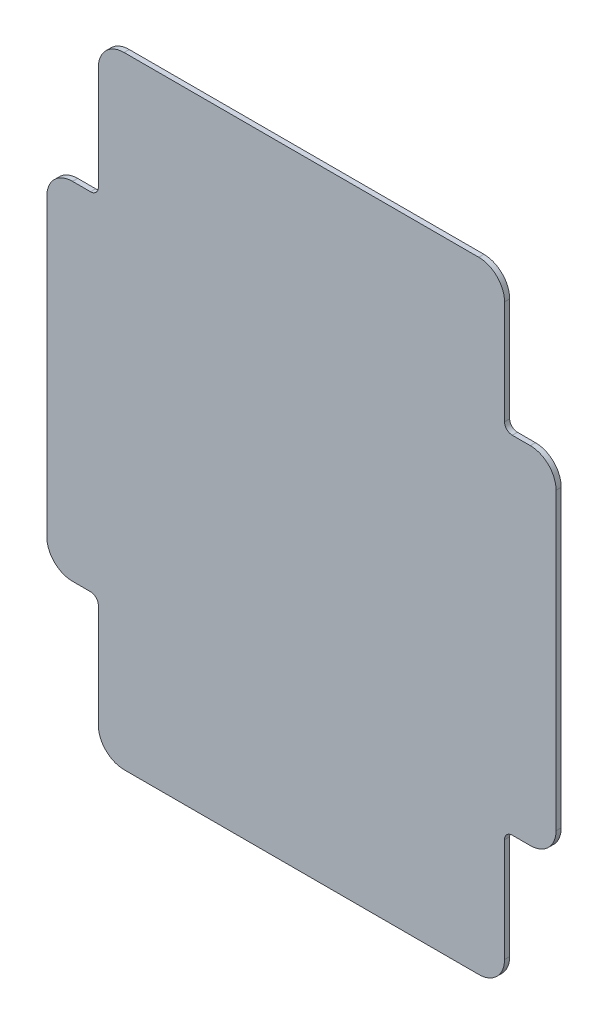
ISO-10303-21;
HEADER;
FILE_DESCRIPTION(('STEP AP214'),'2;1');
FILE_NAME('part.step','',(''),(''),'','','');
FILE_SCHEMA(('AUTOMOTIVE_DESIGN { 1 0 10303 214 1 1 1 1 }'));
ENDSEC;
DATA;
#1=APPLICATION_CONTEXT('core data for automotive mechanical design processes');
#2=APPLICATION_PROTOCOL_DEFINITION('international standard','automotive_design',2000,#1);
#3=PRODUCT_CONTEXT('',#1,'mechanical');
#4=PRODUCT('Part','Part','',(#3));
#5=PRODUCT_RELATED_PRODUCT_CATEGORY('part','',(#4));
#6=PRODUCT_DEFINITION_FORMATION('','',#4);
#7=PRODUCT_DEFINITION_CONTEXT('part definition',#1,'design');
#8=PRODUCT_DEFINITION('design','',#6,#7);
#9=PRODUCT_DEFINITION_SHAPE('','',#8);
#10=(LENGTH_UNIT() NAMED_UNIT(*) SI_UNIT(.MILLI.,.METRE.));
#11=(NAMED_UNIT(*) PLANE_ANGLE_UNIT() SI_UNIT($,.RADIAN.));
#12=(NAMED_UNIT(*) SI_UNIT($,.STERADIAN.) SOLID_ANGLE_UNIT());
#13=UNCERTAINTY_MEASURE_WITH_UNIT(LENGTH_MEASURE(1.E-05),#10,'distance_accuracy_value','');
#14=(GEOMETRIC_REPRESENTATION_CONTEXT(3) GLOBAL_UNCERTAINTY_ASSIGNED_CONTEXT((#13)) GLOBAL_UNIT_ASSIGNED_CONTEXT((#10,
#11,#12)) REPRESENTATION_CONTEXT('',''));
#15=CARTESIAN_POINT('',(0.,0.,0.));
#16=DIRECTION('',(0.,0.,1.));
#17=DIRECTION('',(1.,0.,0.));
#18=AXIS2_PLACEMENT_3D('',#15,#16,#17);
#19=CARTESIAN_POINT('',(-79.2022354263775,53.,2.));
#20=DIRECTION('',(1.,0.,0.));
#21=DIRECTION('',(0.,1.,0.));
#22=AXIS2_PLACEMENT_3D('',#19,#20,#21);
#23=PLANE('',#22);
#24=DIRECTION('',(0.,-1.,0.));
#25=VECTOR('',#24,1.);
#26=CARTESIAN_POINT('',(-79.2022354263775,53.,0.));
#27=LINE('',#26,#25);
#28=CARTESIAN_POINT('',(-79.2022354263775,48.,0.));
#29=VERTEX_POINT('',#28);
#30=CARTESIAN_POINT('',(-79.2022354263775,7.69999999999999,0.));
#31=VERTEX_POINT('',#30);
#32=EDGE_CURVE('E212',#29,#31,#27,.T.);
#33=ORIENTED_EDGE('',*,*,#32,.T.);
#34=DIRECTION('',(0.,0.,-1.));
#35=VECTOR('',#34,1.);
#36=CARTESIAN_POINT('',(-79.2022354263775,7.69999999999996,2.));
#37=LINE('',#36,#35);
#38=CARTESIAN_POINT('',(-79.2022354263775,7.69999999999999,2.));
#39=VERTEX_POINT('',#38);
#40=EDGE_CURVE('E60',#31,#39,#37,.F.);
#41=ORIENTED_EDGE('',*,*,#40,.T.);
#42=DIRECTION('',(0.,-1.,0.));
#43=VECTOR('',#42,1.);
#44=CARTESIAN_POINT('',(-79.2022354263775,58.,2.));
#45=LINE('',#44,#43);
#46=CARTESIAN_POINT('',(-79.2022354263775,48.,2.));
#47=VERTEX_POINT('',#46);
#48=EDGE_CURVE('E213',#47,#39,#45,.T.);
#49=ORIENTED_EDGE('',*,*,#48,.F.);
#50=DIRECTION('',(0.,0.,-1.));
#51=VECTOR('',#50,1.);
#52=CARTESIAN_POINT('',(-79.2022354263775,48.,2.));
#53=LINE('',#52,#51);
#54=EDGE_CURVE('E204',#47,#29,#53,.T.);
#55=ORIENTED_EDGE('',*,*,#54,.T.);
#56=EDGE_LOOP('',(#33,#41,#49,#55));
#57=FACE_BOUND('',#56,.T.);
#58=ADVANCED_FACE('F38',(#57),#23,.F.);
#59=CARTESIAN_POINT('',(-79.2022354263775,4.69999999999998,2.));
#60=DIRECTION('',(0.,-1.,0.));
#61=DIRECTION('',(1.,0.,0.));
#62=AXIS2_PLACEMENT_3D('',#59,#60,#61);
#63=PLANE('',#62);
#64=DIRECTION('',(-1.,0.,0.));
#65=VECTOR('',#64,1.);
#66=CARTESIAN_POINT('',(-79.2022354263775,4.69999999999998,2.));
#67=LINE('',#66,#65);
#68=CARTESIAN_POINT('',(-82.2022354263775,4.69999999999998,2.));
#69=VERTEX_POINT('',#68);
#70=CARTESIAN_POINT('',(-89.2022354263775,4.69999999999995,2.));
#71=VERTEX_POINT('',#70);
#72=EDGE_CURVE('E502',#69,#71,#67,.T.);
#73=ORIENTED_EDGE('',*,*,#72,.F.);
#74=DIRECTION('',(0.,0.,-1.));
#75=VECTOR('',#74,1.);
#76=CARTESIAN_POINT('',(-82.2022354263775,4.69999999999998,0.));
#77=LINE('',#76,#75);
#78=CARTESIAN_POINT('',(-82.2022354263775,4.69999999999998,0.));
#79=VERTEX_POINT('',#78);
#80=EDGE_CURVE('E386',#69,#79,#77,.T.);
#81=ORIENTED_EDGE('',*,*,#80,.T.);
#82=DIRECTION('',(-1.,0.,0.));
#83=VECTOR('',#82,1.);
#84=CARTESIAN_POINT('',(-79.2022354263775,4.69999999999998,0.));
#85=LINE('',#84,#83);
#86=CARTESIAN_POINT('',(-89.2022354263775,4.69999999999995,0.));
#87=VERTEX_POINT('',#86);
#88=EDGE_CURVE('E220',#79,#87,#85,.T.);
#89=ORIENTED_EDGE('',*,*,#88,.T.);
#90=DIRECTION('',(0.,0.,-1.));
#91=VECTOR('',#90,1.);
#92=CARTESIAN_POINT('',(-89.2022354263775,4.69999999999995,2.));
#93=LINE('',#92,#91);
#94=EDGE_CURVE('E323',#87,#71,#93,.F.);
#95=ORIENTED_EDGE('',*,*,#94,.T.);
#96=EDGE_LOOP('',(#73,#81,#89,#95));
#97=FACE_BOUND('',#96,.T.);
#98=ADVANCED_FACE('F527',(#97),#63,.F.);
#99=CARTESIAN_POINT('',(-99.2022354263775,4.69999999999995,2.));
#100=DIRECTION('',(1.,0.,0.));
#101=DIRECTION('',(0.,1.,0.));
#102=AXIS2_PLACEMENT_3D('',#99,#100,#101);
#103=PLANE('',#102);
#104=DIRECTION('',(0.,-1.,0.));
#105=VECTOR('',#104,1.);
#106=CARTESIAN_POINT('',(-99.2022354263775,4.69999999999995,2.));
#107=LINE('',#106,#105);
#108=CARTESIAN_POINT('',(-99.2022354263775,-5.30000000000004,2.));
#109=VERTEX_POINT('',#108);
#110=CARTESIAN_POINT('',(-99.2022354263775,-119.7,2.));
#111=VERTEX_POINT('',#110);
#112=EDGE_CURVE('E497',#109,#111,#107,.T.);
#113=ORIENTED_EDGE('',*,*,#112,.F.);
#114=DIRECTION('',(0.,0.,-1.));
#115=VECTOR('',#114,1.);
#116=CARTESIAN_POINT('',(-99.2022354263775,-5.30000000000004,2.));
#117=LINE('',#116,#115);
#118=CARTESIAN_POINT('',(-99.2022354263775,-5.30000000000004,0.));
#119=VERTEX_POINT('',#118);
#120=EDGE_CURVE('E319',#109,#119,#117,.T.);
#121=ORIENTED_EDGE('',*,*,#120,.T.);
#122=DIRECTION('',(0.,-1.,0.));
#123=VECTOR('',#122,1.);
#124=CARTESIAN_POINT('',(-99.2022354263775,4.69999999999995,0.));
#125=LINE('',#124,#123);
#126=CARTESIAN_POINT('',(-99.2022354263775,-119.7,0.));
#127=VERTEX_POINT('',#126);
#128=EDGE_CURVE('E224',#119,#127,#125,.T.);
#129=ORIENTED_EDGE('',*,*,#128,.T.);
#130=DIRECTION('',(0.,0.,-1.));
#131=VECTOR('',#130,1.);
#132=CARTESIAN_POINT('',(-99.2022354263775,-119.7,2.));
#133=LINE('',#132,#131);
#134=EDGE_CURVE('E316',#127,#111,#133,.F.);
#135=ORIENTED_EDGE('',*,*,#134,.T.);
#136=EDGE_LOOP('',(#113,#121,#129,#135));
#137=FACE_BOUND('',#136,.T.);
#138=ADVANCED_FACE('F537',(#137),#103,.F.);
#139=CARTESIAN_POINT('',(-99.2022354263775,-129.7,2.));
#140=DIRECTION('',(0.,1.,0.));
#141=DIRECTION('',(0.,0.,1.));
#142=AXIS2_PLACEMENT_3D('',#139,#140,#141);
#143=PLANE('',#142);
#144=DIRECTION('',(1.,0.,0.));
#145=VECTOR('',#144,1.);
#146=CARTESIAN_POINT('',(-99.2022354263775,-129.7,0.));
#147=LINE('',#146,#145);
#148=CARTESIAN_POINT('',(-89.2022354263775,-129.7,0.));
#149=VERTEX_POINT('',#148);
#150=CARTESIAN_POINT('',(-82.2022354263769,-129.7,0.));
#151=VERTEX_POINT('',#150);
#152=EDGE_CURVE('E232',#149,#151,#147,.T.);
#153=ORIENTED_EDGE('',*,*,#152,.T.);
#154=DIRECTION('',(0.,0.,-1.));
#155=VECTOR('',#154,1.);
#156=CARTESIAN_POINT('',(-82.2022354263769,-129.7,2.));
#157=LINE('',#156,#155);
#158=CARTESIAN_POINT('',(-82.2022354263769,-129.7,2.));
#159=VERTEX_POINT('',#158);
#160=EDGE_CURVE('E369',#151,#159,#157,.F.);
#161=ORIENTED_EDGE('',*,*,#160,.T.);
#162=DIRECTION('',(1.,0.,0.));
#163=VECTOR('',#162,1.);
#164=CARTESIAN_POINT('',(-99.2022354263775,-129.7,2.));
#165=LINE('',#164,#163);
#166=CARTESIAN_POINT('',(-89.2022354263775,-129.7,2.));
#167=VERTEX_POINT('',#166);
#168=EDGE_CURVE('E492',#167,#159,#165,.T.);
#169=ORIENTED_EDGE('',*,*,#168,.F.);
#170=DIRECTION('',(0.,0.,-1.));
#171=VECTOR('',#170,1.);
#172=CARTESIAN_POINT('',(-89.2022354263775,-129.7,2.));
#173=LINE('',#172,#171);
#174=EDGE_CURVE('E327',#167,#149,#173,.T.);
#175=ORIENTED_EDGE('',*,*,#174,.T.);
#176=EDGE_LOOP('',(#153,#161,#169,#175));
#177=FACE_BOUND('',#176,.T.);
#178=ADVANCED_FACE('F545',(#177),#143,.F.);
#179=CARTESIAN_POINT('',(-79.2022354263774,-178.,2.));
#180=DIRECTION('',(1.,0.,0.));
#181=DIRECTION('',(0.,1.,0.));
#182=AXIS2_PLACEMENT_3D('',#179,#180,#181);
#183=PLANE('',#182);
#184=DIRECTION('',(0.,-1.,0.));
#185=VECTOR('',#184,1.);
#186=CARTESIAN_POINT('',(-79.2022354263774,-129.7,2.));
#187=LINE('',#186,#185);
#188=CARTESIAN_POINT('',(-79.2022354263774,-132.7,2.));
#189=VERTEX_POINT('',#188);
#190=CARTESIAN_POINT('',(-79.2022354263774,-173.,2.));
#191=VERTEX_POINT('',#190);
#192=EDGE_CURVE('E488',#189,#191,#187,.T.);
#193=ORIENTED_EDGE('',*,*,#192,.F.);
#194=DIRECTION('',(0.,0.,-1.));
#195=VECTOR('',#194,1.);
#196=CARTESIAN_POINT('',(-79.2022354263769,-132.7,0.));
#197=LINE('',#196,#195);
#198=CARTESIAN_POINT('',(-79.2022354263769,-132.7,0.));
#199=VERTEX_POINT('',#198);
#200=EDGE_CURVE('E365',#189,#199,#197,.T.);
#201=ORIENTED_EDGE('',*,*,#200,.T.);
#202=DIRECTION('',(0.,-1.,0.));
#203=VECTOR('',#202,1.);
#204=CARTESIAN_POINT('',(-79.2022354263774,-178.,0.));
#205=LINE('',#204,#203);
#206=CARTESIAN_POINT('',(-79.2022354263774,-173.,0.));
#207=VERTEX_POINT('',#206);
#208=EDGE_CURVE('E236',#199,#207,#205,.T.);
#209=ORIENTED_EDGE('',*,*,#208,.T.);
#210=DIRECTION('',(0.,0.,-1.));
#211=VECTOR('',#210,1.);
#212=CARTESIAN_POINT('',(-79.2022354263774,-173.,2.));
#213=LINE('',#212,#211);
#214=EDGE_CURVE('E338',#207,#191,#213,.F.);
#215=ORIENTED_EDGE('',*,*,#214,.T.);
#216=EDGE_LOOP('',(#193,#201,#209,#215));
#217=FACE_BOUND('',#216,.T.);
#218=ADVANCED_FACE('F553',(#217),#183,.F.);
#219=CARTESIAN_POINT('',(-79.2022354263775,-183.,2.));
#220=DIRECTION('',(0.,1.,0.));
#221=DIRECTION('',(0.,0.,1.));
#222=AXIS2_PLACEMENT_3D('',#219,#220,#221);
#223=PLANE('',#222);
#224=DIRECTION('',(1.,0.,0.));
#225=VECTOR('',#224,1.);
#226=CARTESIAN_POINT('',(-79.2022354263775,-183.,2.));
#227=LINE('',#226,#225);
#228=CARTESIAN_POINT('',(-69.2022354263774,-183.,2.));
#229=VERTEX_POINT('',#228);
#230=CARTESIAN_POINT('',(68.3977645736226,-183.,2.));
#231=VERTEX_POINT('',#230);
#232=EDGE_CURVE('E483',#229,#231,#227,.T.);
#233=ORIENTED_EDGE('',*,*,#232,.F.);
#234=DIRECTION('',(0.,0.,-1.));
#235=VECTOR('',#234,1.);
#236=CARTESIAN_POINT('',(-69.2022354263774,-183.,2.));
#237=LINE('',#236,#235);
#238=CARTESIAN_POINT('',(-69.2022354263774,-183.,0.));
#239=VERTEX_POINT('',#238);
#240=EDGE_CURVE('E334',#229,#239,#237,.T.);
#241=ORIENTED_EDGE('',*,*,#240,.T.);
#242=DIRECTION('',(1.,0.,0.));
#243=VECTOR('',#242,1.);
#244=CARTESIAN_POINT('',(-79.2022354263775,-183.,0.));
#245=LINE('',#244,#243);
#246=CARTESIAN_POINT('',(68.3977645736226,-183.,0.));
#247=VERTEX_POINT('',#246);
#248=EDGE_CURVE('E239',#239,#247,#245,.T.);
#249=ORIENTED_EDGE('',*,*,#248,.T.);
#250=DIRECTION('',(0.,0.,-1.));
#251=VECTOR('',#250,1.);
#252=CARTESIAN_POINT('',(68.3977645736226,-183.,2.));
#253=LINE('',#252,#251);
#254=EDGE_CURVE('E331',#247,#231,#253,.F.);
#255=ORIENTED_EDGE('',*,*,#254,.T.);
#256=EDGE_LOOP('',(#233,#241,#249,#255));
#257=FACE_BOUND('',#256,.T.);
#258=ADVANCED_FACE('F563',(#257),#223,.F.);
#259=CARTESIAN_POINT('',(78.3977645736226,-178.,2.));
#260=DIRECTION('',(-1.,0.,0.));
#261=DIRECTION('',(0.,-1.,0.));
#262=AXIS2_PLACEMENT_3D('',#259,#260,#261);
#263=PLANE('',#262);
#264=DIRECTION('',(0.,1.,0.));
#265=VECTOR('',#264,1.);
#266=CARTESIAN_POINT('',(78.3977645736226,-178.,0.));
#267=LINE('',#266,#265);
#268=CARTESIAN_POINT('',(78.3977645736226,-173.,0.));
#269=VERTEX_POINT('',#268);
#270=CARTESIAN_POINT('',(78.3977645736226,-132.7,0.));
#271=VERTEX_POINT('',#270);
#272=EDGE_CURVE('E243',#269,#271,#267,.T.);
#273=ORIENTED_EDGE('',*,*,#272,.T.);
#274=DIRECTION('',(0.,0.,-1.));
#275=VECTOR('',#274,1.);
#276=CARTESIAN_POINT('',(78.3977645736226,-132.7,2.));
#277=LINE('',#276,#275);
#278=CARTESIAN_POINT('',(78.3977645736225,-132.7,2.));
#279=VERTEX_POINT('',#278);
#280=EDGE_CURVE('E376',#271,#279,#277,.F.);
#281=ORIENTED_EDGE('',*,*,#280,.T.);
#282=DIRECTION('',(0.,1.,0.));
#283=VECTOR('',#282,1.);
#284=CARTESIAN_POINT('',(78.3977645736226,-183.,2.));
#285=LINE('',#284,#283);
#286=CARTESIAN_POINT('',(78.3977645736226,-173.,2.));
#287=VERTEX_POINT('',#286);
#288=EDGE_CURVE('E478',#287,#279,#285,.T.);
#289=ORIENTED_EDGE('',*,*,#288,.F.);
#290=DIRECTION('',(0.,0.,-1.));
#291=VECTOR('',#290,1.);
#292=CARTESIAN_POINT('',(78.3977645736226,-173.,2.));
#293=LINE('',#292,#291);
#294=EDGE_CURVE('E342',#287,#269,#293,.T.);
#295=ORIENTED_EDGE('',*,*,#294,.T.);
#296=EDGE_LOOP('',(#273,#281,#289,#295));
#297=FACE_BOUND('',#296,.T.);
#298=ADVANCED_FACE('F572',(#297),#263,.F.);
#299=CARTESIAN_POINT('',(78.3977645736226,-129.7,2.));
#300=DIRECTION('',(0.,1.,0.));
#301=DIRECTION('',(-1.,0.,0.));
#302=AXIS2_PLACEMENT_3D('',#299,#300,#301);
#303=PLANE('',#302);
#304=DIRECTION('',(1.,0.,0.));
#305=VECTOR('',#304,1.);
#306=CARTESIAN_POINT('',(78.3977645736226,-129.7,2.));
#307=LINE('',#306,#305);
#308=CARTESIAN_POINT('',(81.3977645736226,-129.7,2.));
#309=VERTEX_POINT('',#308);
#310=CARTESIAN_POINT('',(88.3977645736225,-129.7,2.));
#311=VERTEX_POINT('',#310);
#312=EDGE_CURVE('E474',#309,#311,#307,.T.);
#313=ORIENTED_EDGE('',*,*,#312,.F.);
#314=DIRECTION('',(0.,0.,-1.));
#315=VECTOR('',#314,1.);
#316=CARTESIAN_POINT('',(81.3977645736226,-129.7,0.));
#317=LINE('',#316,#315);
#318=CARTESIAN_POINT('',(81.3977645736226,-129.7,0.));
#319=VERTEX_POINT('',#318);
#320=EDGE_CURVE('E372',#309,#319,#317,.T.);
#321=ORIENTED_EDGE('',*,*,#320,.T.);
#322=DIRECTION('',(1.,0.,0.));
#323=VECTOR('',#322,1.);
#324=CARTESIAN_POINT('',(78.3977645736226,-129.7,0.));
#325=LINE('',#324,#323);
#326=CARTESIAN_POINT('',(88.3977645736225,-129.7,0.));
#327=VERTEX_POINT('',#326);
#328=EDGE_CURVE('E247',#319,#327,#325,.T.);
#329=ORIENTED_EDGE('',*,*,#328,.T.);
#330=DIRECTION('',(0.,0.,-1.));
#331=VECTOR('',#330,1.);
#332=CARTESIAN_POINT('',(88.3977645736225,-129.7,2.));
#333=LINE('',#332,#331);
#334=EDGE_CURVE('E353',#327,#311,#333,.F.);
#335=ORIENTED_EDGE('',*,*,#334,.T.);
#336=EDGE_LOOP('',(#313,#321,#329,#335));
#337=FACE_BOUND('',#336,.T.);
#338=ADVANCED_FACE('F580',(#337),#303,.F.);
#339=CARTESIAN_POINT('',(98.3977645736225,-129.7,2.));
#340=DIRECTION('',(-1.,0.,0.));
#341=DIRECTION('',(0.,0.,1.));
#342=AXIS2_PLACEMENT_3D('',#339,#340,#341);
#343=PLANE('',#342);
#344=DIRECTION('',(0.,1.,0.));
#345=VECTOR('',#344,1.);
#346=CARTESIAN_POINT('',(98.3977645736225,-129.7,2.));
#347=LINE('',#346,#345);
#348=CARTESIAN_POINT('',(98.3977645736225,-119.7,2.));
#349=VERTEX_POINT('',#348);
#350=CARTESIAN_POINT('',(98.3977645736225,-5.29999999999999,2.));
#351=VERTEX_POINT('',#350);
#352=EDGE_CURVE('E469',#349,#351,#347,.T.);
#353=ORIENTED_EDGE('',*,*,#352,.F.);
#354=DIRECTION('',(0.,0.,-1.));
#355=VECTOR('',#354,1.);
#356=CARTESIAN_POINT('',(98.3977645736225,-119.7,2.));
#357=LINE('',#356,#355);
#358=CARTESIAN_POINT('',(98.3977645736225,-119.7,0.));
#359=VERTEX_POINT('',#358);
#360=EDGE_CURVE('E349',#349,#359,#357,.T.);
#361=ORIENTED_EDGE('',*,*,#360,.T.);
#362=DIRECTION('',(0.,1.,0.));
#363=VECTOR('',#362,1.);
#364=CARTESIAN_POINT('',(98.3977645736225,-129.7,0.));
#365=LINE('',#364,#363);
#366=CARTESIAN_POINT('',(98.3977645736225,-5.29999999999999,0.));
#367=VERTEX_POINT('',#366);
#368=EDGE_CURVE('E250',#359,#367,#365,.T.);
#369=ORIENTED_EDGE('',*,*,#368,.T.);
#370=DIRECTION('',(0.,0.,-1.));
#371=VECTOR('',#370,1.);
#372=CARTESIAN_POINT('',(98.3977645736225,-5.29999999999999,2.));
#373=LINE('',#372,#371);
#374=EDGE_CURVE('E346',#367,#351,#373,.F.);
#375=ORIENTED_EDGE('',*,*,#374,.T.);
#376=EDGE_LOOP('',(#353,#361,#369,#375));
#377=FACE_BOUND('',#376,.T.);
#378=ADVANCED_FACE('F590',(#377),#343,.F.);
#379=CARTESIAN_POINT('',(98.3977645736225,4.69999999999998,2.));
#380=DIRECTION('',(0.,-1.,0.));
#381=DIRECTION('',(1.,0.,0.));
#382=AXIS2_PLACEMENT_3D('',#379,#380,#381);
#383=PLANE('',#382);
#384=DIRECTION('',(-1.,0.,0.));
#385=VECTOR('',#384,1.);
#386=CARTESIAN_POINT('',(98.3977645736225,4.69999999999998,0.));
#387=LINE('',#386,#385);
#388=CARTESIAN_POINT('',(88.3977645736226,4.70000000000001,0.));
#389=VERTEX_POINT('',#388);
#390=CARTESIAN_POINT('',(81.3977645736224,4.70000000000004,0.));
#391=VERTEX_POINT('',#390);
#392=EDGE_CURVE('E254',#389,#391,#387,.T.);
#393=ORIENTED_EDGE('',*,*,#392,.T.);
#394=DIRECTION('',(0.,0.,-1.));
#395=VECTOR('',#394,1.);
#396=CARTESIAN_POINT('',(81.3977645736224,4.70000000000004,2.));
#397=LINE('',#396,#395);
#398=CARTESIAN_POINT('',(81.3977645736224,4.70000000000004,2.));
#399=VERTEX_POINT('',#398);
#400=EDGE_CURVE('E383',#391,#399,#397,.F.);
#401=ORIENTED_EDGE('',*,*,#400,.T.);
#402=DIRECTION('',(-1.,0.,0.));
#403=VECTOR('',#402,1.);
#404=CARTESIAN_POINT('',(98.3977645736225,4.69999999999998,2.));
#405=LINE('',#404,#403);
#406=CARTESIAN_POINT('',(88.3977645736226,4.70000000000001,2.));
#407=VERTEX_POINT('',#406);
#408=EDGE_CURVE('E465',#407,#399,#405,.T.);
#409=ORIENTED_EDGE('',*,*,#408,.F.);
#410=DIRECTION('',(0.,0.,-1.));
#411=VECTOR('',#410,1.);
#412=CARTESIAN_POINT('',(88.3977645736226,4.70000000000001,2.));
#413=LINE('',#412,#411);
#414=EDGE_CURVE('E357',#407,#389,#413,.T.);
#415=ORIENTED_EDGE('',*,*,#414,.T.);
#416=EDGE_LOOP('',(#393,#401,#409,#415));
#417=FACE_BOUND('',#416,.T.);
#418=ADVANCED_FACE('F599',(#417),#383,.F.);
#419=CARTESIAN_POINT('',(78.3977645736225,53.,2.));
#420=DIRECTION('',(-1.,0.,0.));
#421=DIRECTION('',(0.,-1.,0.));
#422=AXIS2_PLACEMENT_3D('',#419,#420,#421);
#423=PLANE('',#422);
#424=DIRECTION('',(0.,1.,0.));
#425=VECTOR('',#424,1.);
#426=CARTESIAN_POINT('',(78.3977645736225,4.70000000000004,2.));
#427=LINE('',#426,#425);
#428=CARTESIAN_POINT('',(78.3977645736225,7.70000000000004,2.));
#429=VERTEX_POINT('',#428);
#430=CARTESIAN_POINT('',(78.3977645736225,48.,2.));
#431=VERTEX_POINT('',#430);
#432=EDGE_CURVE('E462',#429,#431,#427,.T.);
#433=ORIENTED_EDGE('',*,*,#432,.F.);
#434=DIRECTION('',(0.,0.,-1.));
#435=VECTOR('',#434,1.);
#436=CARTESIAN_POINT('',(78.3977645736224,7.70000000000004,0.));
#437=LINE('',#436,#435);
#438=CARTESIAN_POINT('',(78.3977645736224,7.70000000000004,0.));
#439=VERTEX_POINT('',#438);
#440=EDGE_CURVE('E379',#429,#439,#437,.T.);
#441=ORIENTED_EDGE('',*,*,#440,.T.);
#442=DIRECTION('',(0.,1.,0.));
#443=VECTOR('',#442,1.);
#444=CARTESIAN_POINT('',(78.3977645736225,53.,0.));
#445=LINE('',#444,#443);
#446=CARTESIAN_POINT('',(78.3977645736225,48.,0.));
#447=VERTEX_POINT('',#446);
#448=EDGE_CURVE('E258',#439,#447,#445,.T.);
#449=ORIENTED_EDGE('',*,*,#448,.T.);
#450=DIRECTION('',(0.,0.,-1.));
#451=VECTOR('',#450,1.);
#452=CARTESIAN_POINT('',(78.3977645736225,48.,2.));
#453=LINE('',#452,#451);
#454=EDGE_CURVE('E361',#447,#431,#453,.F.);
#455=ORIENTED_EDGE('',*,*,#454,.T.);
#456=EDGE_LOOP('',(#433,#441,#449,#455));
#457=FACE_BOUND('',#456,.T.);
#458=ADVANCED_FACE('F607',(#457),#423,.F.);
#459=CARTESIAN_POINT('',(78.3977645736225,58.,2.));
#460=DIRECTION('',(0.,-1.,0.));
#461=DIRECTION('',(1.,0.,0.));
#462=AXIS2_PLACEMENT_3D('',#459,#460,#461);
#463=PLANE('',#462);
#464=DIRECTION('',(-1.,0.,0.));
#465=VECTOR('',#464,1.);
#466=CARTESIAN_POINT('',(78.3977645736225,58.,0.));
#467=LINE('',#466,#465);
#468=CARTESIAN_POINT('',(68.3977645736225,58.,0.));
#469=VERTEX_POINT('',#468);
#470=CARTESIAN_POINT('',(-69.2022354263775,58.,0.));
#471=VERTEX_POINT('',#470);
#472=EDGE_CURVE('E261',#469,#471,#467,.T.);
#473=ORIENTED_EDGE('',*,*,#472,.T.);
#474=DIRECTION('',(0.,0.,-1.));
#475=VECTOR('',#474,1.);
#476=CARTESIAN_POINT('',(-69.2022354263775,58.,2.));
#477=LINE('',#476,#475);
#478=CARTESIAN_POINT('',(-69.2022354263775,58.,2.));
#479=VERTEX_POINT('',#478);
#480=EDGE_CURVE('E205',#471,#479,#477,.F.);
#481=ORIENTED_EDGE('',*,*,#480,.T.);
#482=DIRECTION('',(-1.,0.,0.));
#483=VECTOR('',#482,1.);
#484=CARTESIAN_POINT('',(78.3977645736225,58.,2.));
#485=LINE('',#484,#483);
#486=CARTESIAN_POINT('',(68.3977645736225,58.,2.));
#487=VERTEX_POINT('',#486);
#488=EDGE_CURVE('E216',#487,#479,#485,.T.);
#489=ORIENTED_EDGE('',*,*,#488,.F.);
#490=DIRECTION('',(0.,0.,-1.));
#491=VECTOR('',#490,1.);
#492=CARTESIAN_POINT('',(68.3977645736225,58.,2.));
#493=LINE('',#492,#491);
#494=EDGE_CURVE('E209',#487,#469,#493,.T.);
#495=ORIENTED_EDGE('',*,*,#494,.T.);
#496=EDGE_LOOP('',(#473,#481,#489,#495));
#497=FACE_BOUND('',#496,.T.);
#498=ADVANCED_FACE('F616',(#497),#463,.F.);
#499=CARTESIAN_POINT('',(0.,0.,2.));
#500=DIRECTION('',(0.,0.,-1.));
#501=DIRECTION('',(-1.,0.,0.));
#502=AXIS2_PLACEMENT_3D('',#499,#500,#501);
#503=PLANE('',#502);
#504=ORIENTED_EDGE('',*,*,#488,.T.);
#505=CARTESIAN_POINT('',(-69.2022354263775,48.,2.));
#506=DIRECTION('',(0.,0.,-1.));
#507=DIRECTION('',(-1.,0.,0.));
#508=AXIS2_PLACEMENT_3D('',#505,#506,#507);
#509=CIRCLE('',#508,10.);
#510=EDGE_CURVE('E313',#479,#47,#509,.F.);
#511=ORIENTED_EDGE('',*,*,#510,.T.);
#512=ORIENTED_EDGE('',*,*,#48,.T.);
#513=CARTESIAN_POINT('',(-82.2022354263775,7.69999999999996,2.));
#514=DIRECTION('',(0.,0.,-1.));
#515=DIRECTION('',(-1.,0.,0.));
#516=AXIS2_PLACEMENT_3D('',#513,#514,#515);
#517=CIRCLE('',#516,3.);
#518=EDGE_CURVE('E11',#39,#69,#517,.T.);
#519=ORIENTED_EDGE('',*,*,#518,.T.);
#520=ORIENTED_EDGE('',*,*,#72,.T.);
#521=CARTESIAN_POINT('',(-89.2022354263775,-5.30000000000003,2.));
#522=DIRECTION('',(0.,0.,-1.));
#523=DIRECTION('',(-1.,0.,0.));
#524=AXIS2_PLACEMENT_3D('',#521,#522,#523);
#525=CIRCLE('',#524,10.);
#526=EDGE_CURVE('E310',#71,#109,#525,.F.);
#527=ORIENTED_EDGE('',*,*,#526,.T.);
#528=ORIENTED_EDGE('',*,*,#112,.T.);
#529=CARTESIAN_POINT('',(-89.2022354263775,-119.7,2.));
#530=DIRECTION('',(0.,0.,-1.));
#531=DIRECTION('',(-1.,0.,0.));
#532=AXIS2_PLACEMENT_3D('',#529,#530,#531);
#533=CIRCLE('',#532,10.);
#534=EDGE_CURVE('E307',#111,#167,#533,.F.);
#535=ORIENTED_EDGE('',*,*,#534,.T.);
#536=ORIENTED_EDGE('',*,*,#168,.T.);
#537=CARTESIAN_POINT('',(-82.2022354263769,-132.7,2.));
#538=DIRECTION('',(0.,0.,-1.));
#539=DIRECTION('',(-1.,0.,0.));
#540=AXIS2_PLACEMENT_3D('',#537,#538,#539);
#541=CIRCLE('',#540,3.);
#542=EDGE_CURVE('E395',#159,#189,#541,.T.);
#543=ORIENTED_EDGE('',*,*,#542,.T.);
#544=ORIENTED_EDGE('',*,*,#192,.T.);
#545=CARTESIAN_POINT('',(-69.2022354263774,-173.,2.));
#546=DIRECTION('',(0.,0.,-1.));
#547=DIRECTION('',(-1.,0.,0.));
#548=AXIS2_PLACEMENT_3D('',#545,#546,#547);
#549=CIRCLE('',#548,10.);
#550=EDGE_CURVE('E304',#191,#229,#549,.F.);
#551=ORIENTED_EDGE('',*,*,#550,.T.);
#552=ORIENTED_EDGE('',*,*,#232,.T.);
#553=CARTESIAN_POINT('',(68.3977645736226,-173.,2.));
#554=DIRECTION('',(0.,0.,-1.));
#555=DIRECTION('',(-1.,0.,0.));
#556=AXIS2_PLACEMENT_3D('',#553,#554,#555);
#557=CIRCLE('',#556,10.);
#558=EDGE_CURVE('E301',#231,#287,#557,.F.);
#559=ORIENTED_EDGE('',*,*,#558,.T.);
#560=ORIENTED_EDGE('',*,*,#288,.T.);
#561=CARTESIAN_POINT('',(81.3977645736226,-132.7,2.));
#562=DIRECTION('',(0.,0.,-1.));
#563=DIRECTION('',(-1.,0.,0.));
#564=AXIS2_PLACEMENT_3D('',#561,#562,#563);
#565=CIRCLE('',#564,3.);
#566=EDGE_CURVE('E401',#279,#309,#565,.T.);
#567=ORIENTED_EDGE('',*,*,#566,.T.);
#568=ORIENTED_EDGE('',*,*,#312,.T.);
#569=CARTESIAN_POINT('',(88.3977645736225,-119.7,2.));
#570=DIRECTION('',(0.,0.,-1.));
#571=DIRECTION('',(-1.,0.,0.));
#572=AXIS2_PLACEMENT_3D('',#569,#570,#571);
#573=CIRCLE('',#572,10.);
#574=EDGE_CURVE('E298',#311,#349,#573,.F.);
#575=ORIENTED_EDGE('',*,*,#574,.T.);
#576=ORIENTED_EDGE('',*,*,#352,.T.);
#577=CARTESIAN_POINT('',(88.3977645736225,-5.29999999999999,2.));
#578=DIRECTION('',(0.,0.,-1.));
#579=DIRECTION('',(-1.,0.,0.));
#580=AXIS2_PLACEMENT_3D('',#577,#578,#579);
#581=CIRCLE('',#580,10.);
#582=EDGE_CURVE('E295',#351,#407,#581,.F.);
#583=ORIENTED_EDGE('',*,*,#582,.T.);
#584=ORIENTED_EDGE('',*,*,#408,.T.);
#585=CARTESIAN_POINT('',(81.3977645736224,7.70000000000004,2.));
#586=DIRECTION('',(0.,0.,-1.));
#587=DIRECTION('',(-1.,0.,0.));
#588=AXIS2_PLACEMENT_3D('',#585,#586,#587);
#589=CIRCLE('',#588,3.);
#590=EDGE_CURVE('E407',#399,#429,#589,.T.);
#591=ORIENTED_EDGE('',*,*,#590,.T.);
#592=ORIENTED_EDGE('',*,*,#432,.T.);
#593=CARTESIAN_POINT('',(68.3977645736225,48.,2.));
#594=DIRECTION('',(0.,0.,-1.));
#595=DIRECTION('',(-1.,0.,0.));
#596=AXIS2_PLACEMENT_3D('',#593,#594,#595);
#597=CIRCLE('',#596,10.);
#598=EDGE_CURVE('E292',#431,#487,#597,.F.);
#599=ORIENTED_EDGE('',*,*,#598,.T.);
#600=EDGE_LOOP('',(#504,#511,#512,#519,#520,#527,#528,#535,#536,#543,#544,#551,#552,#559,#560,
#567,#568,#575,#576,#583,#584,#591,#592,#599));
#601=FACE_BOUND('',#600,.T.);
#602=ADVANCED_FACE('F522',(#601),#503,.F.);
#603=CARTESIAN_POINT('',(0.,0.,0.));
#604=DIRECTION('',(0.,0.,-1.));
#605=DIRECTION('',(-1.,0.,0.));
#606=AXIS2_PLACEMENT_3D('',#603,#604,#605);
#607=PLANE('',#606);
#608=ORIENTED_EDGE('',*,*,#32,.F.);
#609=CARTESIAN_POINT('',(-69.2022354263775,48.,0.));
#610=DIRECTION('',(0.,0.,-1.));
#611=DIRECTION('',(-1.,0.,0.));
#612=AXIS2_PLACEMENT_3D('',#609,#610,#611);
#613=CIRCLE('',#612,10.);
#614=EDGE_CURVE('E200',#29,#471,#613,.T.);
#615=ORIENTED_EDGE('',*,*,#614,.T.);
#616=ORIENTED_EDGE('',*,*,#472,.F.);
#617=CARTESIAN_POINT('',(68.3977645736225,48.,0.));
#618=DIRECTION('',(0.,0.,-1.));
#619=DIRECTION('',(-1.,0.,0.));
#620=AXIS2_PLACEMENT_3D('',#617,#618,#619);
#621=CIRCLE('',#620,10.);
#622=EDGE_CURVE('E215',#469,#447,#621,.T.);
#623=ORIENTED_EDGE('',*,*,#622,.T.);
#624=ORIENTED_EDGE('',*,*,#448,.F.);
#625=CARTESIAN_POINT('',(81.3977645736224,7.70000000000004,0.));
#626=DIRECTION('',(0.,0.,-1.));
#627=DIRECTION('',(-1.,0.,0.));
#628=AXIS2_PLACEMENT_3D('',#625,#626,#627);
#629=CIRCLE('',#628,3.);
#630=EDGE_CURVE('E404',#439,#391,#629,.F.);
#631=ORIENTED_EDGE('',*,*,#630,.T.);
#632=ORIENTED_EDGE('',*,*,#392,.F.);
#633=CARTESIAN_POINT('',(88.3977645736225,-5.29999999999999,0.));
#634=DIRECTION('',(0.,0.,-1.));
#635=DIRECTION('',(-1.,0.,0.));
#636=AXIS2_PLACEMENT_3D('',#633,#634,#635);
#637=CIRCLE('',#636,10.);
#638=EDGE_CURVE('E267',#389,#367,#637,.T.);
#639=ORIENTED_EDGE('',*,*,#638,.T.);
#640=ORIENTED_EDGE('',*,*,#368,.F.);
#641=CARTESIAN_POINT('',(88.3977645736225,-119.7,0.));
#642=DIRECTION('',(0.,0.,-1.));
#643=DIRECTION('',(-1.,0.,0.));
#644=AXIS2_PLACEMENT_3D('',#641,#642,#643);
#645=CIRCLE('',#644,10.);
#646=EDGE_CURVE('E270',#359,#327,#645,.T.);
#647=ORIENTED_EDGE('',*,*,#646,.T.);
#648=ORIENTED_EDGE('',*,*,#328,.F.);
#649=CARTESIAN_POINT('',(81.3977645736226,-132.7,0.));
#650=DIRECTION('',(0.,0.,-1.));
#651=DIRECTION('',(-1.,0.,0.));
#652=AXIS2_PLACEMENT_3D('',#649,#650,#651);
#653=CIRCLE('',#652,3.);
#654=EDGE_CURVE('E398',#319,#271,#653,.F.);
#655=ORIENTED_EDGE('',*,*,#654,.T.);
#656=ORIENTED_EDGE('',*,*,#272,.F.);
#657=CARTESIAN_POINT('',(68.3977645736226,-173.,0.));
#658=DIRECTION('',(0.,0.,-1.));
#659=DIRECTION('',(-1.,0.,0.));
#660=AXIS2_PLACEMENT_3D('',#657,#658,#659);
#661=CIRCLE('',#660,10.);
#662=EDGE_CURVE('E274',#269,#247,#661,.T.);
#663=ORIENTED_EDGE('',*,*,#662,.T.);
#664=ORIENTED_EDGE('',*,*,#248,.F.);
#665=CARTESIAN_POINT('',(-69.2022354263774,-173.,0.));
#666=DIRECTION('',(0.,0.,-1.));
#667=DIRECTION('',(-1.,0.,0.));
#668=AXIS2_PLACEMENT_3D('',#665,#666,#667);
#669=CIRCLE('',#668,10.);
#670=EDGE_CURVE('E277',#239,#207,#669,.T.);
#671=ORIENTED_EDGE('',*,*,#670,.T.);
#672=ORIENTED_EDGE('',*,*,#208,.F.);
#673=CARTESIAN_POINT('',(-82.2022354263769,-132.7,0.));
#674=DIRECTION('',(0.,0.,-1.));
#675=DIRECTION('',(-1.,0.,0.));
#676=AXIS2_PLACEMENT_3D('',#673,#674,#675);
#677=CIRCLE('',#676,3.);
#678=EDGE_CURVE('E392',#199,#151,#677,.F.);
#679=ORIENTED_EDGE('',*,*,#678,.T.);
#680=ORIENTED_EDGE('',*,*,#152,.F.);
#681=CARTESIAN_POINT('',(-89.2022354263775,-119.7,0.));
#682=DIRECTION('',(0.,0.,-1.));
#683=DIRECTION('',(-1.,0.,0.));
#684=AXIS2_PLACEMENT_3D('',#681,#682,#683);
#685=CIRCLE('',#684,10.);
#686=EDGE_CURVE('E281',#149,#127,#685,.T.);
#687=ORIENTED_EDGE('',*,*,#686,.T.);
#688=ORIENTED_EDGE('',*,*,#128,.F.);
#689=CARTESIAN_POINT('',(-89.2022354263775,-5.30000000000003,0.));
#690=DIRECTION('',(0.,0.,-1.));
#691=DIRECTION('',(-1.,0.,0.));
#692=AXIS2_PLACEMENT_3D('',#689,#690,#691);
#693=CIRCLE('',#692,10.);
#694=EDGE_CURVE('E210',#119,#87,#693,.T.);
#695=ORIENTED_EDGE('',*,*,#694,.T.);
#696=ORIENTED_EDGE('',*,*,#88,.F.);
#697=CARTESIAN_POINT('',(-82.2022354263775,7.69999999999996,0.));
#698=DIRECTION('',(0.,0.,-1.));
#699=DIRECTION('',(-1.,0.,0.));
#700=AXIS2_PLACEMENT_3D('',#697,#698,#699);
#701=CIRCLE('',#700,3.);
#702=EDGE_CURVE('E47',#79,#31,#701,.F.);
#703=ORIENTED_EDGE('',*,*,#702,.T.);
#704=EDGE_LOOP('',(#608,#615,#616,#623,#624,#631,#632,#639,#640,#647,#648,#655,#656,#663,#664,
#671,#672,#679,#680,#687,#688,#695,#696,#703));
#705=FACE_BOUND('',#704,.T.);
#706=ADVANCED_FACE('F218',(#705),#607,.T.);
#707=CARTESIAN_POINT('',(-69.2022354263775,48.,2.));
#708=DIRECTION('',(0.,0.,-1.));
#709=DIRECTION('',(-1.,0.,0.));
#710=AXIS2_PLACEMENT_3D('',#707,#708,#709);
#711=CYLINDRICAL_SURFACE('',#710,10.);
#712=ORIENTED_EDGE('',*,*,#510,.F.);
#713=ORIENTED_EDGE('',*,*,#480,.F.);
#714=ORIENTED_EDGE('',*,*,#614,.F.);
#715=ORIENTED_EDGE('',*,*,#54,.F.);
#716=EDGE_LOOP('',(#712,#713,#714,#715));
#717=FACE_BOUND('',#716,.T.);
#718=ADVANCED_FACE('F203',(#717),#711,.T.);
#719=CARTESIAN_POINT('',(-89.2022354263775,-5.30000000000003,2.));
#720=DIRECTION('',(0.,0.,-1.));
#721=DIRECTION('',(-1.,0.,0.));
#722=AXIS2_PLACEMENT_3D('',#719,#720,#721);
#723=CYLINDRICAL_SURFACE('',#722,10.);
#724=ORIENTED_EDGE('',*,*,#526,.F.);
#725=ORIENTED_EDGE('',*,*,#94,.F.);
#726=ORIENTED_EDGE('',*,*,#694,.F.);
#727=ORIENTED_EDGE('',*,*,#120,.F.);
#728=EDGE_LOOP('',(#724,#725,#726,#727));
#729=FACE_BOUND('',#728,.T.);
#730=ADVANCED_FACE('F533',(#729),#723,.T.);
#731=CARTESIAN_POINT('',(-89.2022354263775,-119.7,2.));
#732=DIRECTION('',(0.,0.,-1.));
#733=DIRECTION('',(-1.,0.,0.));
#734=AXIS2_PLACEMENT_3D('',#731,#732,#733);
#735=CYLINDRICAL_SURFACE('',#734,10.);
#736=ORIENTED_EDGE('',*,*,#534,.F.);
#737=ORIENTED_EDGE('',*,*,#134,.F.);
#738=ORIENTED_EDGE('',*,*,#686,.F.);
#739=ORIENTED_EDGE('',*,*,#174,.F.);
#740=EDGE_LOOP('',(#736,#737,#738,#739));
#741=FACE_BOUND('',#740,.T.);
#742=ADVANCED_FACE('F540',(#741),#735,.T.);
#743=CARTESIAN_POINT('',(-69.2022354263774,-173.,2.));
#744=DIRECTION('',(0.,0.,-1.));
#745=DIRECTION('',(-1.,0.,0.));
#746=AXIS2_PLACEMENT_3D('',#743,#744,#745);
#747=CYLINDRICAL_SURFACE('',#746,10.);
#748=ORIENTED_EDGE('',*,*,#550,.F.);
#749=ORIENTED_EDGE('',*,*,#214,.F.);
#750=ORIENTED_EDGE('',*,*,#670,.F.);
#751=ORIENTED_EDGE('',*,*,#240,.F.);
#752=EDGE_LOOP('',(#748,#749,#750,#751));
#753=FACE_BOUND('',#752,.T.);
#754=ADVANCED_FACE('F559',(#753),#747,.T.);
#755=CARTESIAN_POINT('',(68.3977645736226,-173.,2.));
#756=DIRECTION('',(0.,0.,-1.));
#757=DIRECTION('',(-1.,0.,0.));
#758=AXIS2_PLACEMENT_3D('',#755,#756,#757);
#759=CYLINDRICAL_SURFACE('',#758,10.);
#760=ORIENTED_EDGE('',*,*,#558,.F.);
#761=ORIENTED_EDGE('',*,*,#254,.F.);
#762=ORIENTED_EDGE('',*,*,#662,.F.);
#763=ORIENTED_EDGE('',*,*,#294,.F.);
#764=EDGE_LOOP('',(#760,#761,#762,#763));
#765=FACE_BOUND('',#764,.T.);
#766=ADVANCED_FACE('F567',(#765),#759,.T.);
#767=CARTESIAN_POINT('',(88.3977645736225,-119.7,2.));
#768=DIRECTION('',(0.,0.,-1.));
#769=DIRECTION('',(-1.,0.,0.));
#770=AXIS2_PLACEMENT_3D('',#767,#768,#769);
#771=CYLINDRICAL_SURFACE('',#770,10.);
#772=ORIENTED_EDGE('',*,*,#574,.F.);
#773=ORIENTED_EDGE('',*,*,#334,.F.);
#774=ORIENTED_EDGE('',*,*,#646,.F.);
#775=ORIENTED_EDGE('',*,*,#360,.F.);
#776=EDGE_LOOP('',(#772,#773,#774,#775));
#777=FACE_BOUND('',#776,.T.);
#778=ADVANCED_FACE('F586',(#777),#771,.T.);
#779=CARTESIAN_POINT('',(88.3977645736225,-5.29999999999999,2.));
#780=DIRECTION('',(0.,0.,-1.));
#781=DIRECTION('',(-1.,0.,0.));
#782=AXIS2_PLACEMENT_3D('',#779,#780,#781);
#783=CYLINDRICAL_SURFACE('',#782,10.);
#784=ORIENTED_EDGE('',*,*,#582,.F.);
#785=ORIENTED_EDGE('',*,*,#374,.F.);
#786=ORIENTED_EDGE('',*,*,#638,.F.);
#787=ORIENTED_EDGE('',*,*,#414,.F.);
#788=EDGE_LOOP('',(#784,#785,#786,#787));
#789=FACE_BOUND('',#788,.T.);
#790=ADVANCED_FACE('F594',(#789),#783,.T.);
#791=CARTESIAN_POINT('',(68.3977645736225,48.,2.));
#792=DIRECTION('',(0.,0.,-1.));
#793=DIRECTION('',(-1.,0.,0.));
#794=AXIS2_PLACEMENT_3D('',#791,#792,#793);
#795=CYLINDRICAL_SURFACE('',#794,10.);
#796=ORIENTED_EDGE('',*,*,#598,.F.);
#797=ORIENTED_EDGE('',*,*,#454,.F.);
#798=ORIENTED_EDGE('',*,*,#622,.F.);
#799=ORIENTED_EDGE('',*,*,#494,.F.);
#800=EDGE_LOOP('',(#796,#797,#798,#799));
#801=FACE_BOUND('',#800,.T.);
#802=ADVANCED_FACE('F613',(#801),#795,.T.);
#803=CARTESIAN_POINT('',(-82.2022354263769,-132.7,2.));
#804=DIRECTION('',(0.,0.,1.));
#805=DIRECTION('',(1.,0.,0.));
#806=AXIS2_PLACEMENT_3D('',#803,#804,#805);
#807=CYLINDRICAL_SURFACE('',#806,3.);
#808=ORIENTED_EDGE('',*,*,#542,.F.);
#809=ORIENTED_EDGE('',*,*,#160,.F.);
#810=ORIENTED_EDGE('',*,*,#678,.F.);
#811=ORIENTED_EDGE('',*,*,#200,.F.);
#812=EDGE_LOOP('',(#808,#809,#810,#811));
#813=FACE_BOUND('',#812,.T.);
#814=ADVANCED_FACE('F549',(#813),#807,.F.);
#815=CARTESIAN_POINT('',(81.3977645736226,-132.7,2.));
#816=DIRECTION('',(0.,0.,1.));
#817=DIRECTION('',(1.,0.,0.));
#818=AXIS2_PLACEMENT_3D('',#815,#816,#817);
#819=CYLINDRICAL_SURFACE('',#818,3.);
#820=ORIENTED_EDGE('',*,*,#566,.F.);
#821=ORIENTED_EDGE('',*,*,#280,.F.);
#822=ORIENTED_EDGE('',*,*,#654,.F.);
#823=ORIENTED_EDGE('',*,*,#320,.F.);
#824=EDGE_LOOP('',(#820,#821,#822,#823));
#825=FACE_BOUND('',#824,.T.);
#826=ADVANCED_FACE('F576',(#825),#819,.F.);
#827=CARTESIAN_POINT('',(81.3977645736224,7.70000000000004,2.));
#828=DIRECTION('',(0.,0.,1.));
#829=DIRECTION('',(1.,0.,0.));
#830=AXIS2_PLACEMENT_3D('',#827,#828,#829);
#831=CYLINDRICAL_SURFACE('',#830,3.);
#832=ORIENTED_EDGE('',*,*,#590,.F.);
#833=ORIENTED_EDGE('',*,*,#400,.F.);
#834=ORIENTED_EDGE('',*,*,#630,.F.);
#835=ORIENTED_EDGE('',*,*,#440,.F.);
#836=EDGE_LOOP('',(#832,#833,#834,#835));
#837=FACE_BOUND('',#836,.T.);
#838=ADVANCED_FACE('F603',(#837),#831,.F.);
#839=CARTESIAN_POINT('',(-82.2022354263775,7.69999999999996,2.));
#840=DIRECTION('',(0.,0.,1.));
#841=DIRECTION('',(1.,0.,0.));
#842=AXIS2_PLACEMENT_3D('',#839,#840,#841);
#843=CYLINDRICAL_SURFACE('',#842,3.);
#844=ORIENTED_EDGE('',*,*,#518,.F.);
#845=ORIENTED_EDGE('',*,*,#40,.F.);
#846=ORIENTED_EDGE('',*,*,#702,.F.);
#847=ORIENTED_EDGE('',*,*,#80,.F.);
#848=EDGE_LOOP('',(#844,#845,#846,#847));
#849=FACE_BOUND('',#848,.T.);
#850=ADVANCED_FACE('F40',(#849),#843,.F.);
#851=CLOSED_SHELL('',(#58,#98,#138,#178,#218,#258,#298,#338,#378,#418,#458,#498,#602,#706,#718,
#730,#742,#754,#766,#778,#790,#802,#814,#826,#838,#850));
#852=MANIFOLD_SOLID_BREP('B2',#851);
#853=ADVANCED_BREP_SHAPE_REPRESENTATION('',(#18,#852),#14);
#854=SHAPE_DEFINITION_REPRESENTATION(#9,#853);
ENDSEC;
END-ISO-10303-21;
